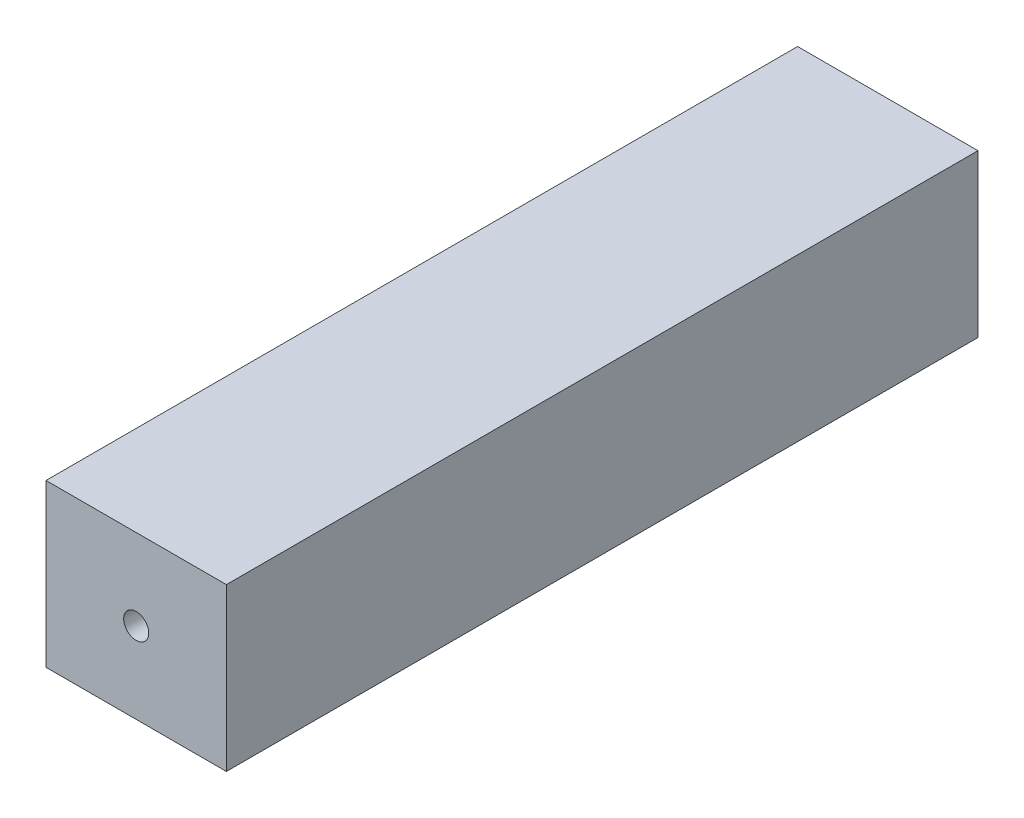
ISO-10303-21;
HEADER;
FILE_DESCRIPTION(('STEP AP214'),'2;1');
FILE_NAME('part.step','',(''),(''),'','','');
FILE_SCHEMA(('AUTOMOTIVE_DESIGN { 1 0 10303 214 1 1 1 1 }'));
ENDSEC;
DATA;
#1=APPLICATION_CONTEXT('core data for automotive mechanical design processes');
#2=APPLICATION_PROTOCOL_DEFINITION('international standard','automotive_design',2000,#1);
#3=PRODUCT_CONTEXT('',#1,'mechanical');
#4=PRODUCT('Part','Part','',(#3));
#5=PRODUCT_RELATED_PRODUCT_CATEGORY('part','',(#4));
#6=PRODUCT_DEFINITION_FORMATION('','',#4);
#7=PRODUCT_DEFINITION_CONTEXT('part definition',#1,'design');
#8=PRODUCT_DEFINITION('design','',#6,#7);
#9=PRODUCT_DEFINITION_SHAPE('','',#8);
#10=(LENGTH_UNIT() NAMED_UNIT(*) SI_UNIT(.MILLI.,.METRE.));
#11=(NAMED_UNIT(*) PLANE_ANGLE_UNIT() SI_UNIT($,.RADIAN.));
#12=(NAMED_UNIT(*) SI_UNIT($,.STERADIAN.) SOLID_ANGLE_UNIT());
#13=UNCERTAINTY_MEASURE_WITH_UNIT(LENGTH_MEASURE(1.E-05),#10,'distance_accuracy_value','');
#14=(GEOMETRIC_REPRESENTATION_CONTEXT(3) GLOBAL_UNCERTAINTY_ASSIGNED_CONTEXT((#13)) GLOBAL_UNIT_ASSIGNED_CONTEXT((#10,
#11,#12)) REPRESENTATION_CONTEXT('',''));
#15=CARTESIAN_POINT('',(0.,0.,0.));
#16=DIRECTION('',(0.,0.,1.));
#17=DIRECTION('',(1.,0.,0.));
#18=AXIS2_PLACEMENT_3D('',#15,#16,#17);
#19=CARTESIAN_POINT('',(-111.410859232749,2.51866646427652,150.));
#20=DIRECTION('',(1.,0.,0.));
#21=DIRECTION('',(0.,0.,-1.));
#22=AXIS2_PLACEMENT_3D('',#19,#20,#21);
#23=PLANE('',#22);
#24=DIRECTION('',(0.,-1.,0.));
#25=VECTOR('',#24,1.);
#26=CARTESIAN_POINT('',(-111.410859232749,2.51866646427652,0.));
#27=LINE('',#26,#25);
#28=CARTESIAN_POINT('',(-111.410859232749,34.8186664642765,0.));
#29=VERTEX_POINT('',#28);
#30=CARTESIAN_POINT('',(-111.410859232749,2.51866646427652,0.));
#31=VERTEX_POINT('',#30);
#32=EDGE_CURVE('E99',#29,#31,#27,.T.);
#33=ORIENTED_EDGE('',*,*,#32,.T.);
#34=DIRECTION('',(0.,0.,-1.));
#35=VECTOR('',#34,1.);
#36=CARTESIAN_POINT('',(-111.410859232749,2.51866646427652,150.));
#37=LINE('',#36,#35);
#38=CARTESIAN_POINT('',(-111.410859232749,2.51866646427652,150.));
#39=VERTEX_POINT('',#38);
#40=EDGE_CURVE('E11',#39,#31,#37,.T.);
#41=ORIENTED_EDGE('',*,*,#40,.F.);
#42=DIRECTION('',(0.,-1.,0.));
#43=VECTOR('',#42,1.);
#44=CARTESIAN_POINT('',(-111.410859232749,2.51866646427652,150.));
#45=LINE('',#44,#43);
#46=CARTESIAN_POINT('',(-111.410859232749,34.8186664642765,150.));
#47=VERTEX_POINT('',#46);
#48=EDGE_CURVE('E108',#47,#39,#45,.T.);
#49=ORIENTED_EDGE('',*,*,#48,.F.);
#50=DIRECTION('',(0.,0.,-1.));
#51=VECTOR('',#50,1.);
#52=CARTESIAN_POINT('',(-111.410859232749,34.8186664642765,150.));
#53=LINE('',#52,#51);
#54=EDGE_CURVE('E113',#47,#29,#53,.T.);
#55=ORIENTED_EDGE('',*,*,#54,.T.);
#56=EDGE_LOOP('',(#33,#41,#49,#55));
#57=FACE_BOUND('',#56,.T.);
#58=ADVANCED_FACE('F38',(#57),#23,.F.);
#59=CARTESIAN_POINT('',(-111.410859232749,2.51866646427652,150.));
#60=DIRECTION('',(0.,1.,0.));
#61=DIRECTION('',(0.,0.,1.));
#62=AXIS2_PLACEMENT_3D('',#59,#60,#61);
#63=PLANE('',#62);
#64=DIRECTION('',(1.,0.,0.));
#65=VECTOR('',#64,1.);
#66=CARTESIAN_POINT('',(-111.410859232749,2.51866646427652,0.));
#67=LINE('',#66,#65);
#68=CARTESIAN_POINT('',(-75.4108592327489,2.51866646427652,0.));
#69=VERTEX_POINT('',#68);
#70=EDGE_CURVE('E103',#31,#69,#67,.T.);
#71=ORIENTED_EDGE('',*,*,#70,.T.);
#72=DIRECTION('',(0.,0.,-1.));
#73=VECTOR('',#72,1.);
#74=CARTESIAN_POINT('',(-75.4108592327489,2.51866646427652,150.));
#75=LINE('',#74,#73);
#76=CARTESIAN_POINT('',(-75.4108592327489,2.51866646427652,150.));
#77=VERTEX_POINT('',#76);
#78=EDGE_CURVE('E46',#77,#69,#75,.T.);
#79=ORIENTED_EDGE('',*,*,#78,.F.);
#80=DIRECTION('',(1.,0.,0.));
#81=VECTOR('',#80,1.);
#82=CARTESIAN_POINT('',(-111.410859232749,2.51866646427652,150.));
#83=LINE('',#82,#81);
#84=EDGE_CURVE('E85',#39,#77,#83,.T.);
#85=ORIENTED_EDGE('',*,*,#84,.F.);
#86=ORIENTED_EDGE('',*,*,#40,.T.);
#87=EDGE_LOOP('',(#71,#79,#85,#86));
#88=FACE_BOUND('',#87,.T.);
#89=ADVANCED_FACE('F137',(#88),#63,.F.);
#90=CARTESIAN_POINT('',(-75.4108592327489,2.51866646427652,150.));
#91=DIRECTION('',(-1.,0.,0.));
#92=DIRECTION('',(0.,0.,1.));
#93=AXIS2_PLACEMENT_3D('',#90,#91,#92);
#94=PLANE('',#93);
#95=DIRECTION('',(0.,1.,0.));
#96=VECTOR('',#95,1.);
#97=CARTESIAN_POINT('',(-75.4108592327489,2.51866646427652,0.));
#98=LINE('',#97,#96);
#99=CARTESIAN_POINT('',(-75.4108592327489,34.8186664642765,0.));
#100=VERTEX_POINT('',#99);
#101=EDGE_CURVE('E72',#69,#100,#98,.T.);
#102=ORIENTED_EDGE('',*,*,#101,.T.);
#103=DIRECTION('',(0.,0.,-1.));
#104=VECTOR('',#103,1.);
#105=CARTESIAN_POINT('',(-75.4108592327489,34.8186664642765,150.));
#106=LINE('',#105,#104);
#107=CARTESIAN_POINT('',(-75.4108592327489,34.8186664642765,150.));
#108=VERTEX_POINT('',#107);
#109=EDGE_CURVE('E119',#108,#100,#106,.T.);
#110=ORIENTED_EDGE('',*,*,#109,.F.);
#111=DIRECTION('',(0.,1.,0.));
#112=VECTOR('',#111,1.);
#113=CARTESIAN_POINT('',(-75.4108592327489,2.51866646427652,150.));
#114=LINE('',#113,#112);
#115=EDGE_CURVE('E111',#77,#108,#114,.T.);
#116=ORIENTED_EDGE('',*,*,#115,.F.);
#117=ORIENTED_EDGE('',*,*,#78,.T.);
#118=EDGE_LOOP('',(#102,#110,#116,#117));
#119=FACE_BOUND('',#118,.T.);
#120=ADVANCED_FACE('F121',(#119),#94,.F.);
#121=CARTESIAN_POINT('',(-111.410859232749,34.8186664642765,150.));
#122=DIRECTION('',(0.,-1.,0.));
#123=DIRECTION('',(0.,0.,-1.));
#124=AXIS2_PLACEMENT_3D('',#121,#122,#123);
#125=PLANE('',#124);
#126=DIRECTION('',(-1.,0.,0.));
#127=VECTOR('',#126,1.);
#128=CARTESIAN_POINT('',(-111.410859232749,34.8186664642765,0.));
#129=LINE('',#128,#127);
#130=EDGE_CURVE('E78',#100,#29,#129,.T.);
#131=ORIENTED_EDGE('',*,*,#130,.T.);
#132=ORIENTED_EDGE('',*,*,#54,.F.);
#133=DIRECTION('',(-1.,0.,0.));
#134=VECTOR('',#133,1.);
#135=CARTESIAN_POINT('',(-111.410859232749,34.8186664642765,150.));
#136=LINE('',#135,#134);
#137=EDGE_CURVE('E54',#108,#47,#136,.T.);
#138=ORIENTED_EDGE('',*,*,#137,.F.);
#139=ORIENTED_EDGE('',*,*,#109,.T.);
#140=EDGE_LOOP('',(#131,#132,#138,#139));
#141=FACE_BOUND('',#140,.T.);
#142=ADVANCED_FACE('F127',(#141),#125,.F.);
#143=CARTESIAN_POINT('',(0.,0.,150.));
#144=DIRECTION('',(0.,0.,-1.));
#145=DIRECTION('',(-1.,0.,0.));
#146=AXIS2_PLACEMENT_3D('',#143,#144,#145);
#147=PLANE('',#146);
#148=CARTESIAN_POINT('',(-93.4108592327489,18.6686664642765,150.));
#149=DIRECTION('',(0.,0.,1.));
#150=DIRECTION('',(1.,0.,0.));
#151=AXIS2_PLACEMENT_3D('',#148,#149,#150);
#152=CIRCLE('',#151,2.49999999999999);
#153=CARTESIAN_POINT('',(-90.9108592327489,18.6686664642765,150.));
#154=VERTEX_POINT('',#153);
#155=EDGE_CURVE('E100',#154,#154,#152,.T.);
#156=ORIENTED_EDGE('',*,*,#155,.F.);
#157=EDGE_LOOP('',(#156));
#158=FACE_BOUND('',#157,.T.);
#159=ORIENTED_EDGE('',*,*,#48,.T.);
#160=ORIENTED_EDGE('',*,*,#84,.T.);
#161=ORIENTED_EDGE('',*,*,#115,.T.);
#162=ORIENTED_EDGE('',*,*,#137,.T.);
#163=EDGE_LOOP('',(#159,#160,#161,#162));
#164=FACE_BOUND('',#163,.T.);
#165=ADVANCED_FACE('F129',(#158,#164),#147,.F.);
#166=CARTESIAN_POINT('',(0.,0.,0.));
#167=DIRECTION('',(0.,0.,-1.));
#168=DIRECTION('',(-1.,0.,0.));
#169=AXIS2_PLACEMENT_3D('',#166,#167,#168);
#170=PLANE('',#169);
#171=ORIENTED_EDGE('',*,*,#32,.F.);
#172=ORIENTED_EDGE('',*,*,#130,.F.);
#173=ORIENTED_EDGE('',*,*,#101,.F.);
#174=ORIENTED_EDGE('',*,*,#70,.F.);
#175=EDGE_LOOP('',(#171,#172,#173,#174));
#176=FACE_BOUND('',#175,.T.);
#177=ADVANCED_FACE('F93',(#176),#170,.T.);
#178=CARTESIAN_POINT('',(-93.4108592327489,18.6686664642765,143.));
#179=DIRECTION('',(0.,0.,1.));
#180=DIRECTION('',(1.,0.,0.));
#181=AXIS2_PLACEMENT_3D('',#178,#179,#180);
#182=CONICAL_SURFACE('',#181,2.5,1.02974425867666);
#183=CARTESIAN_POINT('',(-93.4108592327489,18.6686664642765,141.497848452431));
#184=VERTEX_POINT('',#183);
#185=VERTEX_LOOP('',#184);
#186=FACE_BOUND('',#185,.T.);
#187=CARTESIAN_POINT('',(-93.4108592327489,18.6686664642765,143.));
#188=DIRECTION('',(0.,0.,1.));
#189=DIRECTION('',(1.,0.,0.));
#190=AXIS2_PLACEMENT_3D('',#187,#188,#189);
#191=CIRCLE('',#190,2.5);
#192=CARTESIAN_POINT('',(-90.9108592327489,18.6686664642765,143.));
#193=VERTEX_POINT('',#192);
#194=EDGE_CURVE('E97',#193,#193,#191,.T.);
#195=ORIENTED_EDGE('',*,*,#194,.T.);
#196=EDGE_LOOP('',(#195));
#197=FACE_BOUND('',#196,.T.);
#198=ADVANCED_FACE('F89',(#186,#197),#182,.F.);
#199=CARTESIAN_POINT('',(-93.4108592327489,18.6686664642765,150.));
#200=DIRECTION('',(0.,0.,1.));
#201=DIRECTION('',(1.,0.,0.));
#202=AXIS2_PLACEMENT_3D('',#199,#200,#201);
#203=CYLINDRICAL_SURFACE('',#202,2.5);
#204=ORIENTED_EDGE('',*,*,#194,.F.);
#205=EDGE_LOOP('',(#204));
#206=FACE_BOUND('',#205,.T.);
#207=ORIENTED_EDGE('',*,*,#155,.T.);
#208=EDGE_LOOP('',(#207));
#209=FACE_BOUND('',#208,.T.);
#210=ADVANCED_FACE('F92',(#206,#209),#203,.F.);
#211=CLOSED_SHELL('',(#58,#89,#120,#142,#165,#177,#198,#210));
#212=MANIFOLD_SOLID_BREP('B2',#211);
#213=ADVANCED_BREP_SHAPE_REPRESENTATION('',(#18,#212),#14);
#214=SHAPE_DEFINITION_REPRESENTATION(#9,#213);
ENDSEC;
END-ISO-10303-21;
